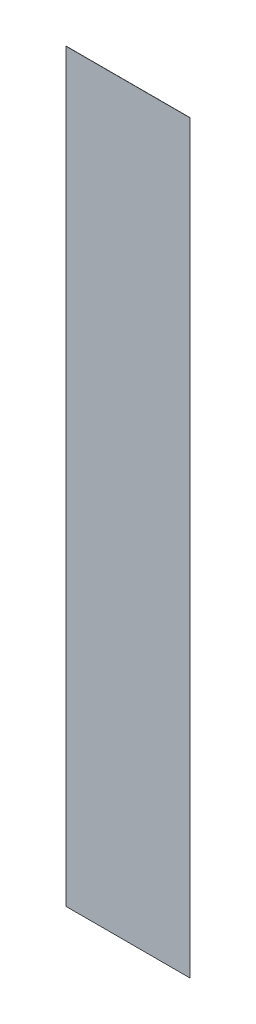
ISO-10303-21;
HEADER;
FILE_DESCRIPTION(('STEP AP214'),'2;1');
FILE_NAME('part.step','',(''),(''),'','','');
FILE_SCHEMA(('AUTOMOTIVE_DESIGN { 1 0 10303 214 1 1 1 1 }'));
ENDSEC;
DATA;
#1=APPLICATION_CONTEXT('core data for automotive mechanical design processes');
#2=APPLICATION_PROTOCOL_DEFINITION('international standard','automotive_design',2000,#1);
#3=PRODUCT_CONTEXT('',#1,'mechanical');
#4=PRODUCT('Part','Part','',(#3));
#5=PRODUCT_RELATED_PRODUCT_CATEGORY('part','',(#4));
#6=PRODUCT_DEFINITION_FORMATION('','',#4);
#7=PRODUCT_DEFINITION_CONTEXT('part definition',#1,'design');
#8=PRODUCT_DEFINITION('design','',#6,#7);
#9=PRODUCT_DEFINITION_SHAPE('','',#8);
#10=(LENGTH_UNIT() NAMED_UNIT(*) SI_UNIT(.MILLI.,.METRE.));
#11=(NAMED_UNIT(*) PLANE_ANGLE_UNIT() SI_UNIT($,.RADIAN.));
#12=(NAMED_UNIT(*) SI_UNIT($,.STERADIAN.) SOLID_ANGLE_UNIT());
#13=UNCERTAINTY_MEASURE_WITH_UNIT(LENGTH_MEASURE(1.E-05),#10,'distance_accuracy_value','');
#14=(GEOMETRIC_REPRESENTATION_CONTEXT(3) GLOBAL_UNCERTAINTY_ASSIGNED_CONTEXT((#13)) GLOBAL_UNIT_ASSIGNED_CONTEXT((#10,
#11,#12)) REPRESENTATION_CONTEXT('',''));
#15=CARTESIAN_POINT('',(0.,0.,0.));
#16=DIRECTION('',(0.,0.,1.));
#17=DIRECTION('',(1.,0.,0.));
#18=AXIS2_PLACEMENT_3D('',#15,#16,#17);
#19=CARTESIAN_POINT('',(-39.4125698324022,31.4129888268156,10.));
#20=DIRECTION('',(1.,0.,0.));
#21=DIRECTION('',(0.,1.,0.));
#22=AXIS2_PLACEMENT_3D('',#19,#20,#21);
#23=PLANE('',#22);
#24=DIRECTION('',(0.,-1.,0.));
#25=VECTOR('',#24,1.);
#26=CARTESIAN_POINT('',(-39.4125698324022,31.4129888268156,0.));
#27=LINE('',#26,#25);
#28=CARTESIAN_POINT('',(-39.4125698324022,31.4129888268156,0.));
#29=VERTEX_POINT('',#28);
#30=CARTESIAN_POINT('',(-39.4125698323978,-35968.5870111732,0.));
#31=VERTEX_POINT('',#30);
#32=EDGE_CURVE('E75',#29,#31,#27,.T.);
#33=ORIENTED_EDGE('',*,*,#32,.T.);
#34=DIRECTION('',(0.,0.,-1.));
#35=VECTOR('',#34,1.);
#36=CARTESIAN_POINT('',(-39.4125698323978,-35968.5870111732,10.));
#37=LINE('',#36,#35);
#38=CARTESIAN_POINT('',(-39.4125698323978,-35968.5870111732,10.));
#39=VERTEX_POINT('',#38);
#40=EDGE_CURVE('E11',#39,#31,#37,.T.);
#41=ORIENTED_EDGE('',*,*,#40,.F.);
#42=DIRECTION('',(0.,-1.,0.));
#43=VECTOR('',#42,1.);
#44=CARTESIAN_POINT('',(-39.4125698324022,31.4129888268156,10.));
#45=LINE('',#44,#43);
#46=CARTESIAN_POINT('',(-39.4125698324022,31.4129888268156,10.));
#47=VERTEX_POINT('',#46);
#48=EDGE_CURVE('E93',#47,#39,#45,.T.);
#49=ORIENTED_EDGE('',*,*,#48,.F.);
#50=DIRECTION('',(0.,0.,-1.));
#51=VECTOR('',#50,1.);
#52=CARTESIAN_POINT('',(-39.4125698324022,31.4129888268156,10.));
#53=LINE('',#52,#51);
#54=EDGE_CURVE('E87',#47,#29,#53,.T.);
#55=ORIENTED_EDGE('',*,*,#54,.T.);
#56=EDGE_LOOP('',(#33,#41,#49,#55));
#57=FACE_BOUND('',#56,.T.);
#58=ADVANCED_FACE('F31',(#57),#23,.F.);
#59=CARTESIAN_POINT('',(-39.4125698323978,-35968.5870111732,10.));
#60=DIRECTION('',(0.,1.,0.));
#61=DIRECTION('',(0.,0.,1.));
#62=AXIS2_PLACEMENT_3D('',#59,#60,#61);
#63=PLANE('',#62);
#64=DIRECTION('',(1.,0.,0.));
#65=VECTOR('',#64,1.);
#66=CARTESIAN_POINT('',(-39.4125698323978,-35968.5870111732,0.));
#67=LINE('',#66,#65);
#68=CARTESIAN_POINT('',(5960.5874301676,-35968.5870111732,0.));
#69=VERTEX_POINT('',#68);
#70=EDGE_CURVE('E71',#31,#69,#67,.T.);
#71=ORIENTED_EDGE('',*,*,#70,.T.);
#72=DIRECTION('',(0.,0.,-1.));
#73=VECTOR('',#72,1.);
#74=CARTESIAN_POINT('',(5960.5874301676,-35968.5870111732,10.));
#75=LINE('',#74,#73);
#76=CARTESIAN_POINT('',(5960.5874301676,-35968.5870111732,10.));
#77=VERTEX_POINT('',#76);
#78=EDGE_CURVE('E38',#77,#69,#75,.T.);
#79=ORIENTED_EDGE('',*,*,#78,.F.);
#80=DIRECTION('',(1.,0.,0.));
#81=VECTOR('',#80,1.);
#82=CARTESIAN_POINT('',(-39.4125698323978,-35968.5870111732,10.));
#83=LINE('',#82,#81);
#84=EDGE_CURVE('E83',#39,#77,#83,.T.);
#85=ORIENTED_EDGE('',*,*,#84,.F.);
#86=ORIENTED_EDGE('',*,*,#40,.T.);
#87=EDGE_LOOP('',(#71,#79,#85,#86));
#88=FACE_BOUND('',#87,.T.);
#89=ADVANCED_FACE('F82',(#88),#63,.F.);
#90=CARTESIAN_POINT('',(5960.5874301676,31.4129888268156,10.));
#91=DIRECTION('',(-1.,0.,0.));
#92=DIRECTION('',(0.,-1.,0.));
#93=AXIS2_PLACEMENT_3D('',#90,#91,#92);
#94=PLANE('',#93);
#95=DIRECTION('',(0.,1.,0.));
#96=VECTOR('',#95,1.);
#97=CARTESIAN_POINT('',(5960.5874301676,31.4129888268156,0.));
#98=LINE('',#97,#96);
#99=CARTESIAN_POINT('',(5960.5874301676,31.4129888268156,0.));
#100=VERTEX_POINT('',#99);
#101=EDGE_CURVE('E76',#69,#100,#98,.T.);
#102=ORIENTED_EDGE('',*,*,#101,.T.);
#103=DIRECTION('',(0.,0.,-1.));
#104=VECTOR('',#103,1.);
#105=CARTESIAN_POINT('',(5960.5874301676,31.4129888268156,10.));
#106=LINE('',#105,#104);
#107=CARTESIAN_POINT('',(5960.5874301676,31.4129888268156,10.));
#108=VERTEX_POINT('',#107);
#109=EDGE_CURVE('E99',#108,#100,#106,.T.);
#110=ORIENTED_EDGE('',*,*,#109,.F.);
#111=DIRECTION('',(0.,1.,0.));
#112=VECTOR('',#111,1.);
#113=CARTESIAN_POINT('',(5960.5874301676,31.4129888268156,10.));
#114=LINE('',#113,#112);
#115=EDGE_CURVE('E50',#77,#108,#114,.T.);
#116=ORIENTED_EDGE('',*,*,#115,.F.);
#117=ORIENTED_EDGE('',*,*,#78,.T.);
#118=EDGE_LOOP('',(#102,#110,#116,#117));
#119=FACE_BOUND('',#118,.T.);
#120=ADVANCED_FACE('F102',(#119),#94,.F.);
#121=CARTESIAN_POINT('',(-39.4125698324022,31.4129888268156,10.));
#122=DIRECTION('',(0.,-1.,0.));
#123=DIRECTION('',(0.,0.,-1.));
#124=AXIS2_PLACEMENT_3D('',#121,#122,#123);
#125=PLANE('',#124);
#126=DIRECTION('',(-1.,0.,0.));
#127=VECTOR('',#126,1.);
#128=CARTESIAN_POINT('',(-39.4125698324022,31.4129888268156,0.));
#129=LINE('',#128,#127);
#130=EDGE_CURVE('E91',#100,#29,#129,.T.);
#131=ORIENTED_EDGE('',*,*,#130,.T.);
#132=ORIENTED_EDGE('',*,*,#54,.F.);
#133=DIRECTION('',(-1.,0.,0.));
#134=VECTOR('',#133,1.);
#135=CARTESIAN_POINT('',(-39.4125698324022,31.4129888268156,10.));
#136=LINE('',#135,#134);
#137=EDGE_CURVE('E45',#108,#47,#136,.T.);
#138=ORIENTED_EDGE('',*,*,#137,.F.);
#139=ORIENTED_EDGE('',*,*,#109,.T.);
#140=EDGE_LOOP('',(#131,#132,#138,#139));
#141=FACE_BOUND('',#140,.T.);
#142=ADVANCED_FACE('F104',(#141),#125,.F.);
#143=CARTESIAN_POINT('',(-39.4125698323978,-35968.5870111732,10.));
#144=DIRECTION('',(0.,0.,1.));
#145=DIRECTION('',(1.,0.,0.));
#146=AXIS2_PLACEMENT_3D('',#143,#144,#145);
#147=PLANE('',#146);
#148=ORIENTED_EDGE('',*,*,#48,.T.);
#149=ORIENTED_EDGE('',*,*,#84,.T.);
#150=ORIENTED_EDGE('',*,*,#115,.T.);
#151=ORIENTED_EDGE('',*,*,#137,.T.);
#152=EDGE_LOOP('',(#148,#149,#150,#151));
#153=FACE_BOUND('',#152,.T.);
#154=ADVANCED_FACE('F105',(#153),#147,.T.);
#155=CARTESIAN_POINT('',(-39.4125698323978,-35968.5870111732,0.));
#156=DIRECTION('',(0.,0.,1.));
#157=DIRECTION('',(1.,0.,0.));
#158=AXIS2_PLACEMENT_3D('',#155,#156,#157);
#159=PLANE('',#158);
#160=ORIENTED_EDGE('',*,*,#32,.F.);
#161=ORIENTED_EDGE('',*,*,#130,.F.);
#162=ORIENTED_EDGE('',*,*,#101,.F.);
#163=ORIENTED_EDGE('',*,*,#70,.F.);
#164=EDGE_LOOP('',(#160,#161,#162,#163));
#165=FACE_BOUND('',#164,.T.);
#166=ADVANCED_FACE('F72',(#165),#159,.F.);
#167=CLOSED_SHELL('',(#58,#89,#120,#142,#154,#166));
#168=MANIFOLD_SOLID_BREP('B2',#167);
#169=ADVANCED_BREP_SHAPE_REPRESENTATION('',(#18,#168),#14);
#170=SHAPE_DEFINITION_REPRESENTATION(#9,#169);
ENDSEC;
END-ISO-10303-21;
